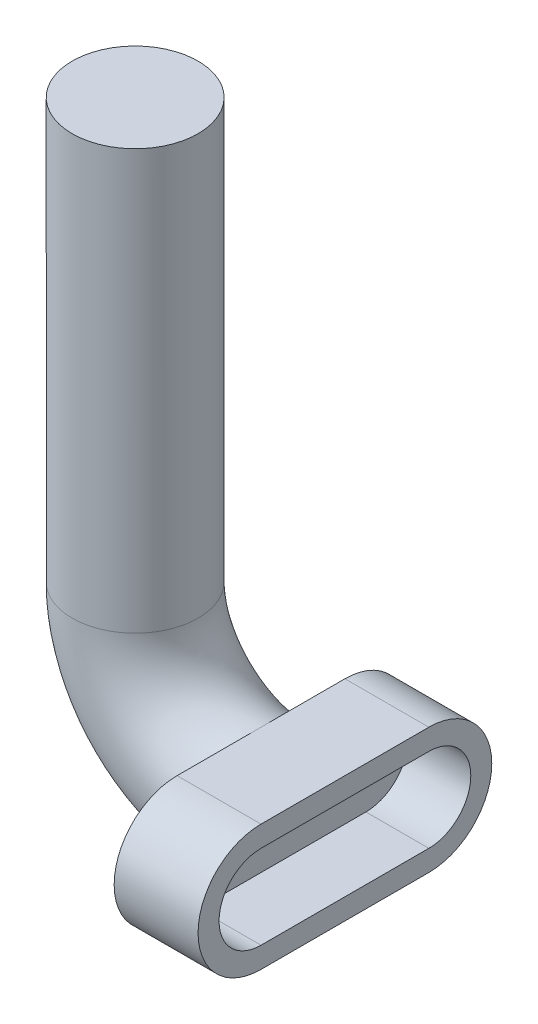
ISO-10303-21;
HEADER;
FILE_DESCRIPTION(('STEP AP214'),'2;1');
FILE_NAME('part.step','',(''),(''),'','','');
FILE_SCHEMA(('AUTOMOTIVE_DESIGN { 1 0 10303 214 1 1 1 1 }'));
ENDSEC;
DATA;
#1=APPLICATION_CONTEXT('core data for automotive mechanical design processes');
#2=APPLICATION_PROTOCOL_DEFINITION('international standard','automotive_design',2000,#1);
#3=PRODUCT_CONTEXT('',#1,'mechanical');
#4=PRODUCT('Part','Part','',(#3));
#5=PRODUCT_RELATED_PRODUCT_CATEGORY('part','',(#4));
#6=PRODUCT_DEFINITION_FORMATION('','',#4);
#7=PRODUCT_DEFINITION_CONTEXT('part definition',#1,'design');
#8=PRODUCT_DEFINITION('design','',#6,#7);
#9=PRODUCT_DEFINITION_SHAPE('','',#8);
#10=(LENGTH_UNIT() NAMED_UNIT(*) SI_UNIT(.MILLI.,.METRE.));
#11=(NAMED_UNIT(*) PLANE_ANGLE_UNIT() SI_UNIT($,.RADIAN.));
#12=(NAMED_UNIT(*) SI_UNIT($,.STERADIAN.) SOLID_ANGLE_UNIT());
#13=UNCERTAINTY_MEASURE_WITH_UNIT(LENGTH_MEASURE(1.E-05),#10,'distance_accuracy_value','');
#14=(GEOMETRIC_REPRESENTATION_CONTEXT(3) GLOBAL_UNCERTAINTY_ASSIGNED_CONTEXT((#13)) GLOBAL_UNIT_ASSIGNED_CONTEXT((#10,
#11,#12)) REPRESENTATION_CONTEXT('',''));
#15=CARTESIAN_POINT('',(0.,0.,0.));
#16=DIRECTION('',(0.,0.,1.));
#17=DIRECTION('',(1.,0.,0.));
#18=AXIS2_PLACEMENT_3D('',#15,#16,#17);
#19=CARTESIAN_POINT('',(0.,0.,25.4));
#20=DIRECTION('',(1.,0.,0.));
#21=DIRECTION('',(0.,0.,-1.));
#22=AXIS2_PLACEMENT_3D('',#19,#20,#21);
#23=PLANE('',#22);
#24=CARTESIAN_POINT('',(0.,0.,0.));
#25=DIRECTION('',(-1.,0.,0.));
#26=DIRECTION('',(0.,0.,1.));
#27=AXIS2_PLACEMENT_3D('',#24,#25,#26);
#28=CIRCLE('',#27,19.05);
#29=CARTESIAN_POINT('',(0.,19.05,0.));
#30=VERTEX_POINT('',#29);
#31=CARTESIAN_POINT('',(0.,-19.05,0.));
#32=VERTEX_POINT('',#31);
#33=EDGE_CURVE('E49',#30,#32,#28,.T.);
#34=ORIENTED_EDGE('',*,*,#33,.F.);
#35=DIRECTION('',(0.,0.,1.));
#36=VECTOR('',#35,1.);
#37=CARTESIAN_POINT('',(0.,19.05,25.4));
#38=LINE('',#37,#36);
#39=CARTESIAN_POINT('',(0.,19.05,-25.4));
#40=VERTEX_POINT('',#39);
#41=EDGE_CURVE('E112',#40,#30,#38,.T.);
#42=ORIENTED_EDGE('',*,*,#41,.F.);
#43=CARTESIAN_POINT('',(0.,0.,-25.4));
#44=DIRECTION('',(1.,0.,0.));
#45=DIRECTION('',(0.,0.,-1.));
#46=AXIS2_PLACEMENT_3D('',#43,#44,#45);
#47=CIRCLE('',#46,19.05);
#48=CARTESIAN_POINT('',(0.,-19.05,-25.4));
#49=VERTEX_POINT('',#48);
#50=EDGE_CURVE('E129',#49,#40,#47,.T.);
#51=ORIENTED_EDGE('',*,*,#50,.F.);
#52=DIRECTION('',(0.,0.,-1.));
#53=VECTOR('',#52,1.);
#54=CARTESIAN_POINT('',(0.,-19.05,25.4));
#55=LINE('',#54,#53);
#56=EDGE_CURVE('E131',#32,#49,#55,.T.);
#57=ORIENTED_EDGE('',*,*,#56,.F.);
#58=EDGE_LOOP('',(#34,#42,#51,#57));
#59=FACE_BOUND('',#58,.T.);
#60=ADVANCED_FACE('F39',(#59),#23,.F.);
#61=CARTESIAN_POINT('',(25.4,0.,25.4));
#62=DIRECTION('',(-1.,0.,0.));
#63=DIRECTION('',(0.,0.,1.));
#64=AXIS2_PLACEMENT_3D('',#61,#62,#63);
#65=CYLINDRICAL_SURFACE('',#64,19.05);
#66=CARTESIAN_POINT('',(0.,0.,25.4));
#67=DIRECTION('',(1.,0.,0.));
#68=DIRECTION('',(0.,0.,-1.));
#69=AXIS2_PLACEMENT_3D('',#66,#67,#68);
#70=CIRCLE('',#69,19.05);
#71=CARTESIAN_POINT('',(0.,19.05,25.4));
#72=VERTEX_POINT('',#71);
#73=CARTESIAN_POINT('',(0.,-19.05,25.4));
#74=VERTEX_POINT('',#73);
#75=EDGE_CURVE('E128',#72,#74,#70,.T.);
#76=ORIENTED_EDGE('',*,*,#75,.T.);
#77=DIRECTION('',(-1.,0.,0.));
#78=VECTOR('',#77,1.);
#79=CARTESIAN_POINT('',(25.4,-19.05,25.4));
#80=LINE('',#79,#78);
#81=CARTESIAN_POINT('',(25.4,-19.05,25.4));
#82=VERTEX_POINT('',#81);
#83=EDGE_CURVE('E43',#82,#74,#80,.T.);
#84=ORIENTED_EDGE('',*,*,#83,.F.);
#85=CARTESIAN_POINT('',(25.4,0.,25.4));
#86=DIRECTION('',(1.,0.,0.));
#87=DIRECTION('',(0.,0.,-1.));
#88=AXIS2_PLACEMENT_3D('',#85,#86,#87);
#89=CIRCLE('',#88,19.05);
#90=CARTESIAN_POINT('',(25.4,19.05,25.4));
#91=VERTEX_POINT('',#90);
#92=EDGE_CURVE('E123',#91,#82,#89,.T.);
#93=ORIENTED_EDGE('',*,*,#92,.F.);
#94=DIRECTION('',(-1.,0.,0.));
#95=VECTOR('',#94,1.);
#96=CARTESIAN_POINT('',(25.4,19.05,25.4));
#97=LINE('',#96,#95);
#98=EDGE_CURVE('E184',#91,#72,#97,.T.);
#99=ORIENTED_EDGE('',*,*,#98,.T.);
#100=EDGE_LOOP('',(#76,#84,#93,#99));
#101=FACE_BOUND('',#100,.T.);
#102=ADVANCED_FACE('F41',(#101),#65,.T.);
#103=CARTESIAN_POINT('',(25.4,-19.05,25.4));
#104=DIRECTION('',(0.,1.,0.));
#105=DIRECTION('',(0.,0.,1.));
#106=AXIS2_PLACEMENT_3D('',#103,#104,#105);
#107=PLANE('',#106);
#108=EDGE_CURVE('E186',#74,#32,#55,.T.);
#109=ORIENTED_EDGE('',*,*,#108,.T.);
#110=ORIENTED_EDGE('',*,*,#56,.T.);
#111=DIRECTION('',(-1.,0.,0.));
#112=VECTOR('',#111,1.);
#113=CARTESIAN_POINT('',(25.4,-19.05,-25.4));
#114=LINE('',#113,#112);
#115=CARTESIAN_POINT('',(25.4,-19.05,-25.4));
#116=VERTEX_POINT('',#115);
#117=EDGE_CURVE('E190',#116,#49,#114,.T.);
#118=ORIENTED_EDGE('',*,*,#117,.F.);
#119=DIRECTION('',(0.,0.,-1.));
#120=VECTOR('',#119,1.);
#121=CARTESIAN_POINT('',(25.4,-19.05,25.4));
#122=LINE('',#121,#120);
#123=EDGE_CURVE('E178',#82,#116,#122,.T.);
#124=ORIENTED_EDGE('',*,*,#123,.F.);
#125=ORIENTED_EDGE('',*,*,#83,.T.);
#126=EDGE_LOOP('',(#109,#110,#118,#124,#125));
#127=FACE_BOUND('',#126,.T.);
#128=ADVANCED_FACE('F198',(#127),#107,.F.);
#129=CARTESIAN_POINT('',(25.4,0.,-25.4));
#130=DIRECTION('',(-1.,0.,0.));
#131=DIRECTION('',(0.,0.,1.));
#132=AXIS2_PLACEMENT_3D('',#129,#130,#131);
#133=CYLINDRICAL_SURFACE('',#132,19.05);
#134=ORIENTED_EDGE('',*,*,#50,.T.);
#135=DIRECTION('',(-1.,0.,0.));
#136=VECTOR('',#135,1.);
#137=CARTESIAN_POINT('',(25.4,19.05,-25.4));
#138=LINE('',#137,#136);
#139=CARTESIAN_POINT('',(25.4,19.05,-25.4));
#140=VERTEX_POINT('',#139);
#141=EDGE_CURVE('E119',#140,#40,#138,.T.);
#142=ORIENTED_EDGE('',*,*,#141,.F.);
#143=CARTESIAN_POINT('',(25.4,0.,-25.4));
#144=DIRECTION('',(1.,0.,0.));
#145=DIRECTION('',(0.,0.,-1.));
#146=AXIS2_PLACEMENT_3D('',#143,#144,#145);
#147=CIRCLE('',#146,19.05);
#148=EDGE_CURVE('E180',#116,#140,#147,.T.);
#149=ORIENTED_EDGE('',*,*,#148,.F.);
#150=ORIENTED_EDGE('',*,*,#117,.T.);
#151=EDGE_LOOP('',(#134,#142,#149,#150));
#152=FACE_BOUND('',#151,.T.);
#153=ADVANCED_FACE('F203',(#152),#133,.T.);
#154=CARTESIAN_POINT('',(25.4,19.05,25.4));
#155=DIRECTION('',(0.,-1.,0.));
#156=DIRECTION('',(0.,0.,-1.));
#157=AXIS2_PLACEMENT_3D('',#154,#155,#156);
#158=PLANE('',#157);
#159=ORIENTED_EDGE('',*,*,#41,.T.);
#160=EDGE_CURVE('E115',#30,#72,#38,.T.);
#161=ORIENTED_EDGE('',*,*,#160,.T.);
#162=ORIENTED_EDGE('',*,*,#98,.F.);
#163=DIRECTION('',(0.,0.,1.));
#164=VECTOR('',#163,1.);
#165=CARTESIAN_POINT('',(25.4,19.05,25.4));
#166=LINE('',#165,#164);
#167=EDGE_CURVE('E182',#140,#91,#166,.T.);
#168=ORIENTED_EDGE('',*,*,#167,.F.);
#169=ORIENTED_EDGE('',*,*,#141,.T.);
#170=EDGE_LOOP('',(#159,#161,#162,#168,#169));
#171=FACE_BOUND('',#170,.T.);
#172=ADVANCED_FACE('F113',(#171),#158,.F.);
#173=CARTESIAN_POINT('',(25.4,0.,25.4));
#174=DIRECTION('',(1.,0.,0.));
#175=DIRECTION('',(0.,0.,-1.));
#176=AXIS2_PLACEMENT_3D('',#173,#174,#175);
#177=PLANE('',#176);
#178=CARTESIAN_POINT('',(25.4,0.,25.4));
#179=DIRECTION('',(1.,0.,0.));
#180=DIRECTION('',(0.,0.,-1.));
#181=AXIS2_PLACEMENT_3D('',#178,#179,#180);
#182=CIRCLE('',#181,12.7);
#183=CARTESIAN_POINT('',(25.4,12.7,25.4));
#184=VERTEX_POINT('',#183);
#185=CARTESIAN_POINT('',(25.4,-12.7,25.4));
#186=VERTEX_POINT('',#185);
#187=EDGE_CURVE('E169',#184,#186,#182,.T.);
#188=ORIENTED_EDGE('',*,*,#187,.F.);
#189=DIRECTION('',(0.,0.,1.));
#190=VECTOR('',#189,1.);
#191=CARTESIAN_POINT('',(25.4,12.7,25.4));
#192=LINE('',#191,#190);
#193=CARTESIAN_POINT('',(25.4,12.7,-25.4));
#194=VERTEX_POINT('',#193);
#195=EDGE_CURVE('E160',#194,#184,#192,.T.);
#196=ORIENTED_EDGE('',*,*,#195,.F.);
#197=CARTESIAN_POINT('',(25.4,0.,-25.4));
#198=DIRECTION('',(1.,0.,0.));
#199=DIRECTION('',(0.,0.,-1.));
#200=AXIS2_PLACEMENT_3D('',#197,#198,#199);
#201=CIRCLE('',#200,12.7);
#202=CARTESIAN_POINT('',(25.4,-12.7,-25.4));
#203=VERTEX_POINT('',#202);
#204=EDGE_CURVE('E173',#203,#194,#201,.T.);
#205=ORIENTED_EDGE('',*,*,#204,.F.);
#206=DIRECTION('',(0.,0.,-1.));
#207=VECTOR('',#206,1.);
#208=CARTESIAN_POINT('',(25.4,-12.7,25.4));
#209=LINE('',#208,#207);
#210=EDGE_CURVE('E171',#186,#203,#209,.T.);
#211=ORIENTED_EDGE('',*,*,#210,.F.);
#212=EDGE_LOOP('',(#188,#196,#205,#211));
#213=FACE_BOUND('',#212,.T.);
#214=ORIENTED_EDGE('',*,*,#92,.T.);
#215=ORIENTED_EDGE('',*,*,#123,.T.);
#216=ORIENTED_EDGE('',*,*,#148,.T.);
#217=ORIENTED_EDGE('',*,*,#167,.T.);
#218=EDGE_LOOP('',(#214,#215,#216,#217));
#219=FACE_BOUND('',#218,.T.);
#220=ADVANCED_FACE('F202',(#213,#219),#177,.T.);
#221=EDGE_CURVE('E11',#32,#30,#28,.T.);
#222=ORIENTED_EDGE('',*,*,#221,.F.);
#223=ORIENTED_EDGE('',*,*,#108,.F.);
#224=ORIENTED_EDGE('',*,*,#75,.F.);
#225=ORIENTED_EDGE('',*,*,#160,.F.);
#226=EDGE_LOOP('',(#222,#223,#224,#225));
#227=FACE_BOUND('',#226,.T.);
#228=ADVANCED_FACE('F126',(#227),#23,.F.);
#229=CARTESIAN_POINT('',(25.4,0.,25.4));
#230=DIRECTION('',(-1.,0.,0.));
#231=DIRECTION('',(0.,0.,1.));
#232=AXIS2_PLACEMENT_3D('',#229,#230,#231);
#233=CYLINDRICAL_SURFACE('',#232,12.7);
#234=CARTESIAN_POINT('',(6.35,0.,25.4));
#235=DIRECTION('',(1.,0.,0.));
#236=DIRECTION('',(0.,0.,-1.));
#237=AXIS2_PLACEMENT_3D('',#234,#235,#236);
#238=CIRCLE('',#237,12.7);
#239=CARTESIAN_POINT('',(6.35,12.7,25.4));
#240=VERTEX_POINT('',#239);
#241=CARTESIAN_POINT('',(6.35,-12.7,25.4));
#242=VERTEX_POINT('',#241);
#243=EDGE_CURVE('E134',#240,#242,#238,.T.);
#244=ORIENTED_EDGE('',*,*,#243,.F.);
#245=DIRECTION('',(-1.,0.,0.));
#246=VECTOR('',#245,1.);
#247=CARTESIAN_POINT('',(25.4,12.7,25.4));
#248=LINE('',#247,#246);
#249=EDGE_CURVE('E157',#184,#240,#248,.T.);
#250=ORIENTED_EDGE('',*,*,#249,.F.);
#251=ORIENTED_EDGE('',*,*,#187,.T.);
#252=DIRECTION('',(1.,0.,0.));
#253=VECTOR('',#252,1.);
#254=CARTESIAN_POINT('',(25.4,-12.7,25.4));
#255=LINE('',#254,#253);
#256=EDGE_CURVE('E153',#186,#242,#255,.F.);
#257=ORIENTED_EDGE('',*,*,#256,.T.);
#258=EDGE_LOOP('',(#244,#250,#251,#257));
#259=FACE_BOUND('',#258,.T.);
#260=ADVANCED_FACE('F220',(#259),#233,.F.);
#261=CARTESIAN_POINT('',(25.4,-12.7,25.4));
#262=DIRECTION('',(0.,1.,0.));
#263=DIRECTION('',(0.,0.,1.));
#264=AXIS2_PLACEMENT_3D('',#261,#262,#263);
#265=PLANE('',#264);
#266=DIRECTION('',(0.,0.,-1.));
#267=VECTOR('',#266,1.);
#268=CARTESIAN_POINT('',(6.35,-12.7,25.4));
#269=LINE('',#268,#267);
#270=CARTESIAN_POINT('',(6.35,-12.7,-25.4));
#271=VERTEX_POINT('',#270);
#272=EDGE_CURVE('E152',#242,#271,#269,.T.);
#273=ORIENTED_EDGE('',*,*,#272,.F.);
#274=ORIENTED_EDGE('',*,*,#256,.F.);
#275=ORIENTED_EDGE('',*,*,#210,.T.);
#276=DIRECTION('',(-1.,0.,0.));
#277=VECTOR('',#276,1.);
#278=CARTESIAN_POINT('',(25.4,-12.7,-25.4));
#279=LINE('',#278,#277);
#280=EDGE_CURVE('E156',#203,#271,#279,.T.);
#281=ORIENTED_EDGE('',*,*,#280,.T.);
#282=EDGE_LOOP('',(#273,#274,#275,#281));
#283=FACE_BOUND('',#282,.T.);
#284=ADVANCED_FACE('F225',(#283),#265,.T.);
#285=CARTESIAN_POINT('',(25.4,0.,-25.4));
#286=DIRECTION('',(-1.,0.,0.));
#287=DIRECTION('',(0.,0.,1.));
#288=AXIS2_PLACEMENT_3D('',#285,#286,#287);
#289=CYLINDRICAL_SURFACE('',#288,12.7);
#290=CARTESIAN_POINT('',(6.35,0.,-25.4));
#291=DIRECTION('',(1.,0.,0.));
#292=DIRECTION('',(0.,0.,-1.));
#293=AXIS2_PLACEMENT_3D('',#290,#291,#292);
#294=CIRCLE('',#293,12.7);
#295=CARTESIAN_POINT('',(6.35,12.7,-25.4));
#296=VERTEX_POINT('',#295);
#297=EDGE_CURVE('E162',#271,#296,#294,.T.);
#298=ORIENTED_EDGE('',*,*,#297,.F.);
#299=ORIENTED_EDGE('',*,*,#280,.F.);
#300=ORIENTED_EDGE('',*,*,#204,.T.);
#301=DIRECTION('',(1.,0.,0.));
#302=VECTOR('',#301,1.);
#303=CARTESIAN_POINT('',(25.4,12.7,-25.4));
#304=LINE('',#303,#302);
#305=EDGE_CURVE('E62',#194,#296,#304,.F.);
#306=ORIENTED_EDGE('',*,*,#305,.T.);
#307=EDGE_LOOP('',(#298,#299,#300,#306));
#308=FACE_BOUND('',#307,.T.);
#309=ADVANCED_FACE('F239',(#308),#289,.F.);
#310=CARTESIAN_POINT('',(25.4,12.7,25.4));
#311=DIRECTION('',(0.,-1.,0.));
#312=DIRECTION('',(0.,0.,-1.));
#313=AXIS2_PLACEMENT_3D('',#310,#311,#312);
#314=PLANE('',#313);
#315=DIRECTION('',(0.,0.,1.));
#316=VECTOR('',#315,1.);
#317=CARTESIAN_POINT('',(6.35,12.7,25.4));
#318=LINE('',#317,#316);
#319=EDGE_CURVE('E166',#296,#240,#318,.T.);
#320=ORIENTED_EDGE('',*,*,#319,.F.);
#321=ORIENTED_EDGE('',*,*,#305,.F.);
#322=ORIENTED_EDGE('',*,*,#195,.T.);
#323=ORIENTED_EDGE('',*,*,#249,.T.);
#324=EDGE_LOOP('',(#320,#321,#322,#323));
#325=FACE_BOUND('',#324,.T.);
#326=ADVANCED_FACE('F235',(#325),#314,.T.);
#327=CARTESIAN_POINT('',(6.35,0.,25.4));
#328=DIRECTION('',(1.,0.,0.));
#329=DIRECTION('',(0.,0.,-1.));
#330=AXIS2_PLACEMENT_3D('',#327,#328,#329);
#331=PLANE('',#330);
#332=ORIENTED_EDGE('',*,*,#243,.T.);
#333=ORIENTED_EDGE('',*,*,#272,.T.);
#334=ORIENTED_EDGE('',*,*,#297,.T.);
#335=ORIENTED_EDGE('',*,*,#319,.T.);
#336=EDGE_LOOP('',(#332,#333,#334,#335));
#337=FACE_BOUND('',#336,.T.);
#338=ADVANCED_FACE('F141',(#337),#331,.T.);
#339=CARTESIAN_POINT('',(-38.1,165.1,0.));
#340=DIRECTION('',(0.,1.,0.));
#341=DIRECTION('',(0.,0.,1.));
#342=AXIS2_PLACEMENT_3D('',#339,#340,#341);
#343=PLANE('',#342);
#344=CARTESIAN_POINT('',(-38.1,165.1,0.));
#345=DIRECTION('',(0.,1.,0.));
#346=DIRECTION('',(0.,0.,1.));
#347=AXIS2_PLACEMENT_3D('',#344,#345,#346);
#348=CIRCLE('',#347,19.05);
#349=CARTESIAN_POINT('',(-38.1,165.1,19.05));
#350=VERTEX_POINT('',#349);
#351=EDGE_CURVE('E145',#350,#350,#348,.T.);
#352=ORIENTED_EDGE('',*,*,#351,.T.);
#353=EDGE_LOOP('',(#352));
#354=FACE_BOUND('',#353,.T.);
#355=ADVANCED_FACE('F234',(#354),#343,.T.);
#356=CARTESIAN_POINT('',(-38.1,165.1,0.));
#357=DIRECTION('',(0.,-1.,0.));
#358=DIRECTION('',(1.,0.,0.));
#359=AXIS2_PLACEMENT_3D('',#356,#357,#358);
#360=CYLINDRICAL_SURFACE('',#359,19.05);
#361=CARTESIAN_POINT('',(-38.1,38.1,0.));
#362=DIRECTION('',(0.,1.,0.));
#363=DIRECTION('',(0.,0.,1.));
#364=AXIS2_PLACEMENT_3D('',#361,#362,#363);
#365=CIRCLE('',#364,19.05);
#366=CARTESIAN_POINT('',(-38.1,38.1,19.05));
#367=VERTEX_POINT('',#366);
#368=EDGE_CURVE('E135',#367,#367,#365,.T.);
#369=ORIENTED_EDGE('',*,*,#368,.T.);
#370=EDGE_LOOP('',(#369));
#371=FACE_BOUND('',#370,.T.);
#372=ORIENTED_EDGE('',*,*,#351,.F.);
#373=EDGE_LOOP('',(#372));
#374=FACE_BOUND('',#373,.T.);
#375=ADVANCED_FACE('F139',(#371,#374),#360,.T.);
#376=CARTESIAN_POINT('',(0.,38.1,0.));
#377=DIRECTION('',(0.,0.,1.));
#378=DIRECTION('',(1.,0.,0.));
#379=AXIS2_PLACEMENT_3D('',#376,#377,#378);
#380=TOROIDAL_SURFACE('',#379,38.1,19.05);
#381=ORIENTED_EDGE('',*,*,#33,.T.);
#382=ORIENTED_EDGE('',*,*,#221,.T.);
#383=EDGE_LOOP('',(#381,#382));
#384=FACE_BOUND('',#383,.T.);
#385=ORIENTED_EDGE('',*,*,#368,.F.);
#386=EDGE_LOOP('',(#385));
#387=FACE_BOUND('',#386,.T.);
#388=ADVANCED_FACE('F136',(#384,#387),#380,.T.);
#389=CLOSED_SHELL('',(#60,#102,#128,#153,#172,#220,#228,#260,#284,#309,#326,#338,#355,#375,#388));
#390=MANIFOLD_SOLID_BREP('B2',#389);
#391=ADVANCED_BREP_SHAPE_REPRESENTATION('',(#18,#390),#14);
#392=SHAPE_DEFINITION_REPRESENTATION(#9,#391);
ENDSEC;
END-ISO-10303-21;
